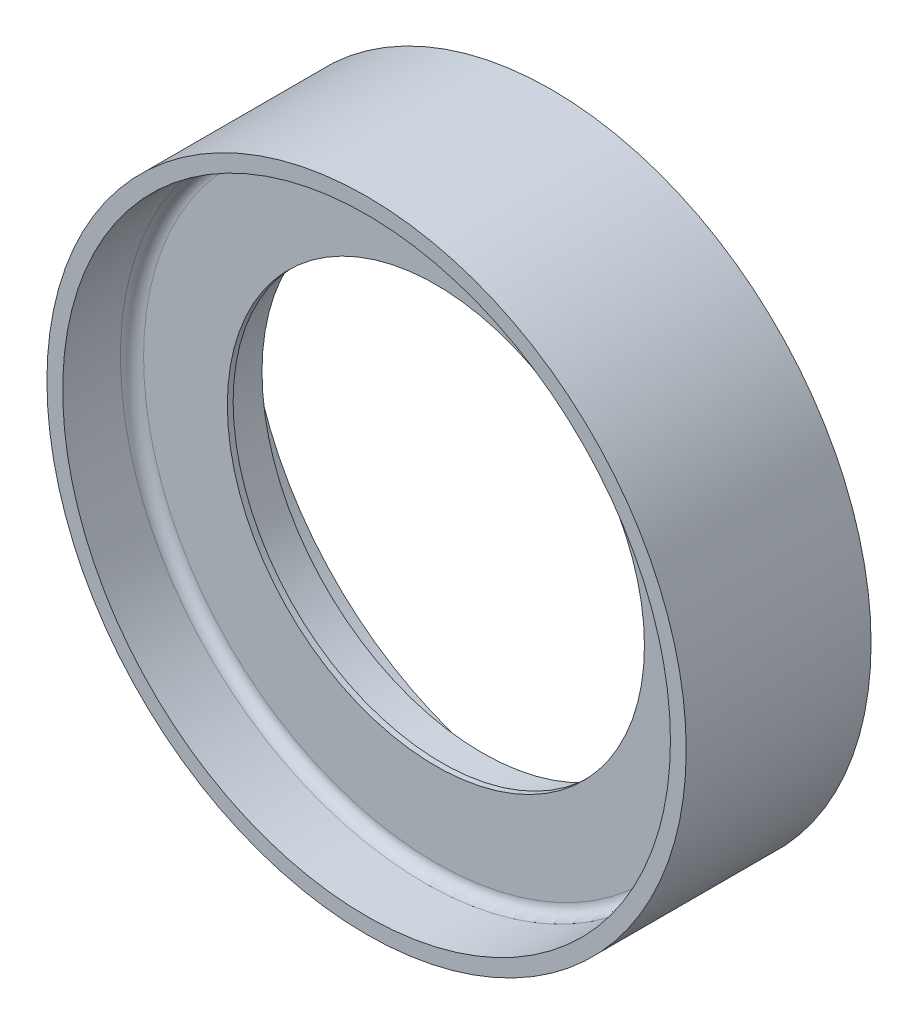
ISO-10303-21;
HEADER;
FILE_DESCRIPTION(('STEP AP214'),'2;1');
FILE_NAME('part.step','',(''),(''),'','','');
FILE_SCHEMA(('AUTOMOTIVE_DESIGN { 1 0 10303 214 1 1 1 1 }'));
ENDSEC;
DATA;
#1=APPLICATION_CONTEXT('core data for automotive mechanical design processes');
#2=APPLICATION_PROTOCOL_DEFINITION('international standard','automotive_design',2000,#1);
#3=PRODUCT_CONTEXT('',#1,'mechanical');
#4=PRODUCT('Part','Part','',(#3));
#5=PRODUCT_RELATED_PRODUCT_CATEGORY('part','',(#4));
#6=PRODUCT_DEFINITION_FORMATION('','',#4);
#7=PRODUCT_DEFINITION_CONTEXT('part definition',#1,'design');
#8=PRODUCT_DEFINITION('design','',#6,#7);
#9=PRODUCT_DEFINITION_SHAPE('','',#8);
#10=(LENGTH_UNIT() NAMED_UNIT(*) SI_UNIT(.MILLI.,.METRE.));
#11=(NAMED_UNIT(*) PLANE_ANGLE_UNIT() SI_UNIT($,.RADIAN.));
#12=(NAMED_UNIT(*) SI_UNIT($,.STERADIAN.) SOLID_ANGLE_UNIT());
#13=UNCERTAINTY_MEASURE_WITH_UNIT(LENGTH_MEASURE(1.E-05),#10,'distance_accuracy_value','');
#14=(GEOMETRIC_REPRESENTATION_CONTEXT(3) GLOBAL_UNCERTAINTY_ASSIGNED_CONTEXT((#13)) GLOBAL_UNIT_ASSIGNED_CONTEXT((#10,
#11,#12)) REPRESENTATION_CONTEXT('',''));
#15=CARTESIAN_POINT('',(0.,0.,0.));
#16=DIRECTION('',(0.,0.,1.));
#17=DIRECTION('',(1.,0.,0.));
#18=AXIS2_PLACEMENT_3D('',#15,#16,#17);
#19=CARTESIAN_POINT('',(0.,0.,2.));
#20=DIRECTION('',(0.,0.,-1.));
#21=DIRECTION('',(-1.,0.,0.));
#22=AXIS2_PLACEMENT_3D('',#19,#20,#21);
#23=CYLINDRICAL_SURFACE('',#22,9.025);
#24=CARTESIAN_POINT('',(0.,0.,2.));
#25=DIRECTION('',(0.,0.,1.));
#26=DIRECTION('',(1.,0.,0.));
#27=AXIS2_PLACEMENT_3D('',#24,#25,#26);
#28=CIRCLE('',#27,9.025);
#29=CARTESIAN_POINT('',(9.025,0.,2.));
#30=VERTEX_POINT('',#29);
#31=EDGE_CURVE('E56',#30,#30,#28,.T.);
#32=ORIENTED_EDGE('',*,*,#31,.T.);
#33=EDGE_LOOP('',(#32));
#34=FACE_BOUND('',#33,.T.);
#35=CARTESIAN_POINT('',(0.,0.,1.75));
#36=DIRECTION('',(0.,0.,-1.));
#37=DIRECTION('',(-1.,0.,0.));
#38=AXIS2_PLACEMENT_3D('',#35,#36,#37);
#39=CIRCLE('',#38,9.025);
#40=CARTESIAN_POINT('',(-9.025,0.,1.75));
#41=VERTEX_POINT('',#40);
#42=EDGE_CURVE('E34',#41,#41,#39,.T.);
#43=ORIENTED_EDGE('',*,*,#42,.T.);
#44=EDGE_LOOP('',(#43));
#45=FACE_BOUND('',#44,.T.);
#46=ADVANCED_FACE('F30',(#34,#45),#23,.F.);
#47=CARTESIAN_POINT('',(0.,0.,2.));
#48=DIRECTION('',(0.,0.,1.));
#49=DIRECTION('',(1.,0.,0.));
#50=AXIS2_PLACEMENT_3D('',#47,#48,#49);
#51=PLANE('',#50);
#52=CARTESIAN_POINT('',(0.,0.,2.));
#53=DIRECTION('',(0.,0.,1.));
#54=DIRECTION('',(1.,0.,0.));
#55=AXIS2_PLACEMENT_3D('',#52,#53,#54);
#56=CIRCLE('',#55,12.65);
#57=CARTESIAN_POINT('',(12.65,0.,2.));
#58=VERTEX_POINT('',#57);
#59=EDGE_CURVE('E10',#58,#58,#56,.T.);
#60=ORIENTED_EDGE('',*,*,#59,.T.);
#61=EDGE_LOOP('',(#60));
#62=FACE_BOUND('',#61,.T.);
#63=ORIENTED_EDGE('',*,*,#31,.F.);
#64=EDGE_LOOP('',(#63));
#65=FACE_BOUND('',#64,.T.);
#66=ADVANCED_FACE('F86',(#62,#65),#51,.T.);
#67=CARTESIAN_POINT('',(0.,0.,-3.));
#68=DIRECTION('',(0.,0.,1.));
#69=DIRECTION('',(1.,0.,0.));
#70=AXIS2_PLACEMENT_3D('',#67,#68,#69);
#71=CYLINDRICAL_SURFACE('',#70,13.8327);
#72=CARTESIAN_POINT('',(0.,0.,-3.));
#73=DIRECTION('',(0.,0.,1.));
#74=DIRECTION('',(1.,0.,0.));
#75=AXIS2_PLACEMENT_3D('',#72,#73,#74);
#76=CIRCLE('',#75,13.8327);
#77=CARTESIAN_POINT('',(13.8327,0.,-3.));
#78=VERTEX_POINT('',#77);
#79=EDGE_CURVE('E50',#78,#78,#76,.T.);
#80=ORIENTED_EDGE('',*,*,#79,.T.);
#81=EDGE_LOOP('',(#80));
#82=FACE_BOUND('',#81,.T.);
#83=CARTESIAN_POINT('',(0.,0.,5.));
#84=DIRECTION('',(0.,0.,1.));
#85=DIRECTION('',(1.,0.,0.));
#86=AXIS2_PLACEMENT_3D('',#83,#84,#85);
#87=CIRCLE('',#86,13.8327);
#88=CARTESIAN_POINT('',(13.8327,0.,5.));
#89=VERTEX_POINT('',#88);
#90=EDGE_CURVE('E59',#89,#89,#87,.T.);
#91=ORIENTED_EDGE('',*,*,#90,.F.);
#92=EDGE_LOOP('',(#91));
#93=FACE_BOUND('',#92,.T.);
#94=ADVANCED_FACE('F92',(#82,#93),#71,.T.);
#95=CARTESIAN_POINT('',(0.,0.,-3.));
#96=DIRECTION('',(0.,0.,1.));
#97=DIRECTION('',(1.,0.,0.));
#98=AXIS2_PLACEMENT_3D('',#95,#96,#97);
#99=PLANE('',#98);
#100=CARTESIAN_POINT('',(0.,0.,-3.));
#101=DIRECTION('',(0.,0.,1.));
#102=DIRECTION('',(1.,0.,0.));
#103=AXIS2_PLACEMENT_3D('',#100,#101,#102);
#104=CIRCLE('',#103,13.15);
#105=CARTESIAN_POINT('',(13.15,0.,-3.));
#106=VERTEX_POINT('',#105);
#107=EDGE_CURVE('E53',#106,#106,#104,.T.);
#108=ORIENTED_EDGE('',*,*,#107,.T.);
#109=EDGE_LOOP('',(#108));
#110=FACE_BOUND('',#109,.T.);
#111=ORIENTED_EDGE('',*,*,#79,.F.);
#112=EDGE_LOOP('',(#111));
#113=FACE_BOUND('',#112,.T.);
#114=ADVANCED_FACE('F105',(#110,#113),#99,.F.);
#115=CARTESIAN_POINT('',(0.,0.,-3.));
#116=DIRECTION('',(0.,0.,1.));
#117=DIRECTION('',(1.,0.,0.));
#118=AXIS2_PLACEMENT_3D('',#115,#116,#117);
#119=CYLINDRICAL_SURFACE('',#118,13.15);
#120=CARTESIAN_POINT('',(0.,0.,-0.5));
#121=DIRECTION('',(0.,0.,1.));
#122=DIRECTION('',(1.,0.,0.));
#123=AXIS2_PLACEMENT_3D('',#120,#121,#122);
#124=CIRCLE('',#123,13.15);
#125=CARTESIAN_POINT('',(13.15,0.,-0.5));
#126=VERTEX_POINT('',#125);
#127=EDGE_CURVE('E47',#126,#126,#124,.T.);
#128=ORIENTED_EDGE('',*,*,#127,.T.);
#129=EDGE_LOOP('',(#128));
#130=FACE_BOUND('',#129,.T.);
#131=ORIENTED_EDGE('',*,*,#107,.F.);
#132=EDGE_LOOP('',(#131));
#133=FACE_BOUND('',#132,.T.);
#134=ADVANCED_FACE('F101',(#130,#133),#119,.F.);
#135=CARTESIAN_POINT('',(0.,0.,0.));
#136=DIRECTION('',(0.,0.,1.));
#137=DIRECTION('',(1.,0.,0.));
#138=AXIS2_PLACEMENT_3D('',#135,#136,#137);
#139=PLANE('',#138);
#140=CARTESIAN_POINT('',(0.,0.,0.));
#141=DIRECTION('',(0.,0.,-1.));
#142=DIRECTION('',(-1.,0.,0.));
#143=AXIS2_PLACEMENT_3D('',#140,#141,#142);
#144=CIRCLE('',#143,9.525);
#145=CARTESIAN_POINT('',(-9.525,0.,0.));
#146=VERTEX_POINT('',#145);
#147=EDGE_CURVE('E65',#146,#146,#144,.T.);
#148=ORIENTED_EDGE('',*,*,#147,.F.);
#149=EDGE_LOOP('',(#148));
#150=FACE_BOUND('',#149,.T.);
#151=CARTESIAN_POINT('',(0.,0.,0.));
#152=DIRECTION('',(0.,0.,1.));
#153=DIRECTION('',(1.,0.,0.));
#154=AXIS2_PLACEMENT_3D('',#151,#152,#153);
#155=CIRCLE('',#154,12.65);
#156=CARTESIAN_POINT('',(12.65,0.,0.));
#157=VERTEX_POINT('',#156);
#158=EDGE_CURVE('E42',#157,#157,#155,.F.);
#159=ORIENTED_EDGE('',*,*,#158,.T.);
#160=EDGE_LOOP('',(#159));
#161=FACE_BOUND('',#160,.T.);
#162=ADVANCED_FACE('F98',(#150,#161),#139,.F.);
#163=CARTESIAN_POINT('',(0.,0.,5.));
#164=DIRECTION('',(0.,0.,1.));
#165=DIRECTION('',(1.,0.,0.));
#166=AXIS2_PLACEMENT_3D('',#163,#164,#165);
#167=PLANE('',#166);
#168=ORIENTED_EDGE('',*,*,#90,.T.);
#169=EDGE_LOOP('',(#168));
#170=FACE_BOUND('',#169,.T.);
#171=CARTESIAN_POINT('',(0.,0.,5.));
#172=DIRECTION('',(0.,0.,1.));
#173=DIRECTION('',(1.,0.,0.));
#174=AXIS2_PLACEMENT_3D('',#171,#172,#173);
#175=CIRCLE('',#174,13.15);
#176=CARTESIAN_POINT('',(13.15,0.,5.));
#177=VERTEX_POINT('',#176);
#178=EDGE_CURVE('E62',#177,#177,#175,.T.);
#179=ORIENTED_EDGE('',*,*,#178,.F.);
#180=EDGE_LOOP('',(#179));
#181=FACE_BOUND('',#180,.T.);
#182=ADVANCED_FACE('F95',(#170,#181),#167,.T.);
#183=CARTESIAN_POINT('',(0.,0.,5.));
#184=DIRECTION('',(0.,0.,-1.));
#185=DIRECTION('',(-1.,0.,0.));
#186=AXIS2_PLACEMENT_3D('',#183,#184,#185);
#187=CYLINDRICAL_SURFACE('',#186,13.15);
#188=CARTESIAN_POINT('',(0.,0.,2.5));
#189=DIRECTION('',(0.,0.,1.));
#190=DIRECTION('',(1.,0.,0.));
#191=AXIS2_PLACEMENT_3D('',#188,#189,#190);
#192=CIRCLE('',#191,13.15);
#193=CARTESIAN_POINT('',(13.15,0.,2.5));
#194=VERTEX_POINT('',#193);
#195=EDGE_CURVE('E38',#194,#194,#192,.F.);
#196=ORIENTED_EDGE('',*,*,#195,.T.);
#197=EDGE_LOOP('',(#196));
#198=FACE_BOUND('',#197,.T.);
#199=ORIENTED_EDGE('',*,*,#178,.T.);
#200=EDGE_LOOP('',(#199));
#201=FACE_BOUND('',#200,.T.);
#202=ADVANCED_FACE('F114',(#198,#201),#187,.F.);
#203=CARTESIAN_POINT('',(0.,0.,-0.5));
#204=DIRECTION('',(0.,0.,1.));
#205=DIRECTION('',(1.,0.,0.));
#206=AXIS2_PLACEMENT_3D('',#203,#204,#205);
#207=TOROIDAL_SURFACE('',#206,12.65,0.5);
#208=ORIENTED_EDGE('',*,*,#158,.F.);
#209=EDGE_LOOP('',(#208));
#210=FACE_BOUND('',#209,.T.);
#211=ORIENTED_EDGE('',*,*,#127,.F.);
#212=EDGE_LOOP('',(#211));
#213=FACE_BOUND('',#212,.T.);
#214=ADVANCED_FACE('F112',(#210,#213),#207,.F.);
#215=CARTESIAN_POINT('',(0.,0.,2.5));
#216=DIRECTION('',(0.,0.,1.));
#217=DIRECTION('',(1.,0.,0.));
#218=AXIS2_PLACEMENT_3D('',#215,#216,#217);
#219=TOROIDAL_SURFACE('',#218,12.65,0.5);
#220=ORIENTED_EDGE('',*,*,#59,.F.);
#221=EDGE_LOOP('',(#220));
#222=FACE_BOUND('',#221,.T.);
#223=ORIENTED_EDGE('',*,*,#195,.F.);
#224=EDGE_LOOP('',(#223));
#225=FACE_BOUND('',#224,.T.);
#226=ADVANCED_FACE('F32',(#222,#225),#219,.F.);
#227=CARTESIAN_POINT('',(0.,0.,1.75));
#228=DIRECTION('',(0.,0.,-1.));
#229=DIRECTION('',(-1.,0.,0.));
#230=AXIS2_PLACEMENT_3D('',#227,#228,#229);
#231=CYLINDRICAL_SURFACE('',#230,9.525);
#232=CARTESIAN_POINT('',(0.,0.,1.75));
#233=DIRECTION('',(0.,0.,-1.));
#234=DIRECTION('',(-1.,0.,0.));
#235=AXIS2_PLACEMENT_3D('',#232,#233,#234);
#236=CIRCLE('',#235,9.525);
#237=CARTESIAN_POINT('',(-9.525,0.,1.75));
#238=VERTEX_POINT('',#237);
#239=EDGE_CURVE('E68',#238,#238,#236,.T.);
#240=ORIENTED_EDGE('',*,*,#239,.F.);
#241=EDGE_LOOP('',(#240));
#242=FACE_BOUND('',#241,.T.);
#243=ORIENTED_EDGE('',*,*,#147,.T.);
#244=EDGE_LOOP('',(#243));
#245=FACE_BOUND('',#244,.T.);
#246=ADVANCED_FACE('F78',(#242,#245),#231,.F.);
#247=CARTESIAN_POINT('',(0.,0.,1.75));
#248=DIRECTION('',(0.,0.,-1.));
#249=DIRECTION('',(-1.,0.,0.));
#250=AXIS2_PLACEMENT_3D('',#247,#248,#249);
#251=PLANE('',#250);
#252=ORIENTED_EDGE('',*,*,#42,.F.);
#253=EDGE_LOOP('',(#252));
#254=FACE_BOUND('',#253,.T.);
#255=ORIENTED_EDGE('',*,*,#239,.T.);
#256=EDGE_LOOP('',(#255));
#257=FACE_BOUND('',#256,.T.);
#258=ADVANCED_FACE('F76',(#254,#257),#251,.T.);
#259=CLOSED_SHELL('',(#46,#66,#94,#114,#134,#162,#182,#202,#214,#226,#246,#258));
#260=MANIFOLD_SOLID_BREP('B2',#259);
#261=ADVANCED_BREP_SHAPE_REPRESENTATION('',(#18,#260),#14);
#262=SHAPE_DEFINITION_REPRESENTATION(#9,#261);
ENDSEC;
END-ISO-10303-21;
